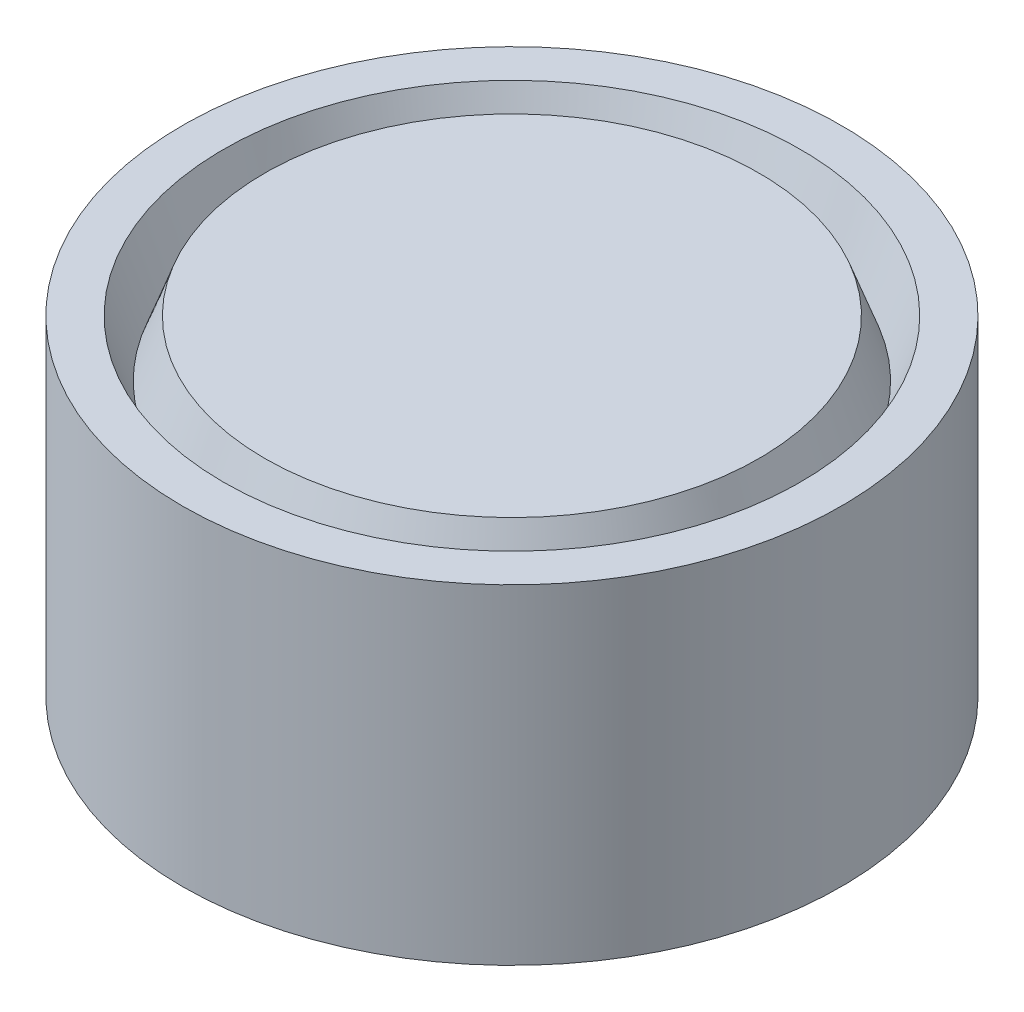
ISO-10303-21;
HEADER;
FILE_DESCRIPTION(('STEP AP214'),'2;1');
FILE_NAME('part.step','',(''),(''),'','','');
FILE_SCHEMA(('AUTOMOTIVE_DESIGN { 1 0 10303 214 1 1 1 1 }'));
ENDSEC;
DATA;
#1=APPLICATION_CONTEXT('core data for automotive mechanical design processes');
#2=APPLICATION_PROTOCOL_DEFINITION('international standard','automotive_design',2000,#1);
#3=PRODUCT_CONTEXT('',#1,'mechanical');
#4=PRODUCT('Part','Part','',(#3));
#5=PRODUCT_RELATED_PRODUCT_CATEGORY('part','',(#4));
#6=PRODUCT_DEFINITION_FORMATION('','',#4);
#7=PRODUCT_DEFINITION_CONTEXT('part definition',#1,'design');
#8=PRODUCT_DEFINITION('design','',#6,#7);
#9=PRODUCT_DEFINITION_SHAPE('','',#8);
#10=(LENGTH_UNIT() NAMED_UNIT(*) SI_UNIT(.MILLI.,.METRE.));
#11=(NAMED_UNIT(*) PLANE_ANGLE_UNIT() SI_UNIT($,.RADIAN.));
#12=(NAMED_UNIT(*) SI_UNIT($,.STERADIAN.) SOLID_ANGLE_UNIT());
#13=UNCERTAINTY_MEASURE_WITH_UNIT(LENGTH_MEASURE(1.E-05),#10,'distance_accuracy_value','');
#14=(GEOMETRIC_REPRESENTATION_CONTEXT(3) GLOBAL_UNCERTAINTY_ASSIGNED_CONTEXT((#13)) GLOBAL_UNIT_ASSIGNED_CONTEXT((#10,
#11,#12)) REPRESENTATION_CONTEXT('',''));
#15=CARTESIAN_POINT('',(0.,0.,0.));
#16=DIRECTION('',(0.,0.,1.));
#17=DIRECTION('',(1.,0.,0.));
#18=AXIS2_PLACEMENT_3D('',#15,#16,#17);
#19=CARTESIAN_POINT('',(0.,20.,0.));
#20=DIRECTION('',(0.,-1.,0.));
#21=DIRECTION('',(0.,0.,-1.));
#22=AXIS2_PLACEMENT_3D('',#19,#20,#21);
#23=CYLINDRICAL_SURFACE('',#22,20.);
#24=CARTESIAN_POINT('',(0.,20.,0.));
#25=DIRECTION('',(0.,1.,0.));
#26=DIRECTION('',(0.,0.,1.));
#27=AXIS2_PLACEMENT_3D('',#24,#25,#26);
#28=CIRCLE('',#27,20.);
#29=CARTESIAN_POINT('',(0.,20.,20.));
#30=VERTEX_POINT('',#29);
#31=EDGE_CURVE('E10',#30,#30,#28,.T.);
#32=ORIENTED_EDGE('',*,*,#31,.F.);
#33=EDGE_LOOP('',(#32));
#34=FACE_BOUND('',#33,.T.);
#35=CARTESIAN_POINT('',(0.,0.,0.));
#36=DIRECTION('',(0.,1.,0.));
#37=DIRECTION('',(0.,0.,1.));
#38=AXIS2_PLACEMENT_3D('',#35,#36,#37);
#39=CIRCLE('',#38,20.);
#40=CARTESIAN_POINT('',(0.,0.,20.));
#41=VERTEX_POINT('',#40);
#42=EDGE_CURVE('E40',#41,#41,#39,.T.);
#43=ORIENTED_EDGE('',*,*,#42,.T.);
#44=EDGE_LOOP('',(#43));
#45=FACE_BOUND('',#44,.T.);
#46=ADVANCED_FACE('F37',(#34,#45),#23,.T.);
#47=CARTESIAN_POINT('',(0.,20.,0.));
#48=DIRECTION('',(0.,1.,0.));
#49=DIRECTION('',(0.,0.,1.));
#50=AXIS2_PLACEMENT_3D('',#47,#48,#49);
#51=PLANE('',#50);
#52=CARTESIAN_POINT('',(0.,20.,0.));
#53=DIRECTION('',(0.,1.,0.));
#54=DIRECTION('',(0.,0.,1.));
#55=AXIS2_PLACEMENT_3D('',#52,#53,#54);
#56=CIRCLE('',#55,17.5);
#57=CARTESIAN_POINT('',(0.,20.,17.5));
#58=VERTEX_POINT('',#57);
#59=EDGE_CURVE('E51',#58,#58,#56,.T.);
#60=ORIENTED_EDGE('',*,*,#59,.F.);
#61=EDGE_LOOP('',(#60));
#62=FACE_BOUND('',#61,.T.);
#63=ORIENTED_EDGE('',*,*,#31,.T.);
#64=EDGE_LOOP('',(#63));
#65=FACE_BOUND('',#64,.T.);
#66=ADVANCED_FACE('F77',(#62,#65),#51,.T.);
#67=CARTESIAN_POINT('',(0.,0.,0.));
#68=DIRECTION('',(0.,1.,0.));
#69=DIRECTION('',(0.,0.,1.));
#70=AXIS2_PLACEMENT_3D('',#67,#68,#69);
#71=PLANE('',#70);
#72=CARTESIAN_POINT('',(0.,0.,0.));
#73=DIRECTION('',(0.,-1.,0.));
#74=DIRECTION('',(0.,0.,-1.));
#75=AXIS2_PLACEMENT_3D('',#72,#73,#74);
#76=CIRCLE('',#75,2.);
#77=CARTESIAN_POINT('',(0.,0.,-2.));
#78=VERTEX_POINT('',#77);
#79=EDGE_CURVE('E58',#78,#78,#76,.T.);
#80=ORIENTED_EDGE('',*,*,#79,.F.);
#81=EDGE_LOOP('',(#80));
#82=FACE_BOUND('',#81,.T.);
#83=ORIENTED_EDGE('',*,*,#42,.F.);
#84=EDGE_LOOP('',(#83));
#85=FACE_BOUND('',#84,.T.);
#86=ADVANCED_FACE('F73',(#82,#85),#71,.F.);
#87=CARTESIAN_POINT('',(0.,20.,0.));
#88=DIRECTION('',(0.,1.,0.));
#89=DIRECTION('',(0.,0.,1.));
#90=AXIS2_PLACEMENT_3D('',#87,#88,#89);
#91=CONICAL_SURFACE('',#90,17.5,0.349065850398867);
#92=ORIENTED_EDGE('',*,*,#59,.T.);
#93=EDGE_LOOP('',(#92));
#94=FACE_BOUND('',#93,.T.);
#95=CARTESIAN_POINT('',(0.,16.5656532256817,0.));
#96=DIRECTION('',(0.,1.,0.));
#97=DIRECTION('',(0.,0.,1.));
#98=AXIS2_PLACEMENT_3D('',#95,#96,#97);
#99=CIRCLE('',#98,16.25);
#100=CARTESIAN_POINT('',(0.,16.5656532256817,16.25));
#101=VERTEX_POINT('',#100);
#102=EDGE_CURVE('E47',#101,#101,#99,.T.);
#103=ORIENTED_EDGE('',*,*,#102,.F.);
#104=EDGE_LOOP('',(#103));
#105=FACE_BOUND('',#104,.T.);
#106=ADVANCED_FACE('F76',(#94,#105),#91,.F.);
#107=CARTESIAN_POINT('',(0.,20.,0.));
#108=DIRECTION('',(0.,-1.,0.));
#109=DIRECTION('',(0.,0.,1.));
#110=AXIS2_PLACEMENT_3D('',#107,#108,#109);
#111=CONICAL_SURFACE('',#110,15.,0.349065850398867);
#112=ORIENTED_EDGE('',*,*,#102,.T.);
#113=EDGE_LOOP('',(#112));
#114=FACE_BOUND('',#113,.T.);
#115=CARTESIAN_POINT('',(0.,20.,0.));
#116=DIRECTION('',(0.,1.,0.));
#117=DIRECTION('',(0.,0.,1.));
#118=AXIS2_PLACEMENT_3D('',#115,#116,#117);
#119=CIRCLE('',#118,15.);
#120=CARTESIAN_POINT('',(0.,20.,15.));
#121=VERTEX_POINT('',#120);
#122=EDGE_CURVE('E54',#121,#121,#119,.T.);
#123=ORIENTED_EDGE('',*,*,#122,.F.);
#124=EDGE_LOOP('',(#123));
#125=FACE_BOUND('',#124,.T.);
#126=ADVANCED_FACE('F92',(#114,#125),#111,.T.);
#127=ORIENTED_EDGE('',*,*,#122,.T.);
#128=EDGE_LOOP('',(#127));
#129=FACE_BOUND('',#128,.T.);
#130=ADVANCED_FACE('F69',(#129),#51,.T.);
#131=CARTESIAN_POINT('',(0.,5.,0.));
#132=DIRECTION('',(0.,-1.,0.));
#133=DIRECTION('',(0.,0.,-1.));
#134=AXIS2_PLACEMENT_3D('',#131,#132,#133);
#135=CYLINDRICAL_SURFACE('',#134,2.);
#136=CARTESIAN_POINT('',(0.,5.,0.));
#137=DIRECTION('',(0.,-1.,0.));
#138=DIRECTION('',(0.,0.,-1.));
#139=AXIS2_PLACEMENT_3D('',#136,#137,#138);
#140=CIRCLE('',#139,2.);
#141=CARTESIAN_POINT('',(0.,5.,-2.));
#142=VERTEX_POINT('',#141);
#143=EDGE_CURVE('E57',#142,#142,#140,.T.);
#144=ORIENTED_EDGE('',*,*,#143,.F.);
#145=EDGE_LOOP('',(#144));
#146=FACE_BOUND('',#145,.T.);
#147=ORIENTED_EDGE('',*,*,#79,.T.);
#148=EDGE_LOOP('',(#147));
#149=FACE_BOUND('',#148,.T.);
#150=ADVANCED_FACE('F66',(#146,#149),#135,.F.);
#151=CARTESIAN_POINT('',(0.,5.,0.));
#152=DIRECTION('',(0.,-1.,0.));
#153=DIRECTION('',(0.,0.,-1.));
#154=AXIS2_PLACEMENT_3D('',#151,#152,#153);
#155=PLANE('',#154);
#156=ORIENTED_EDGE('',*,*,#143,.T.);
#157=EDGE_LOOP('',(#156));
#158=FACE_BOUND('',#157,.T.);
#159=ADVANCED_FACE('F64',(#158),#155,.T.);
#160=CLOSED_SHELL('',(#46,#66,#86,#106,#126,#130,#150,#159));
#161=MANIFOLD_SOLID_BREP('B2',#160);
#162=ADVANCED_BREP_SHAPE_REPRESENTATION('',(#18,#161),#14);
#163=SHAPE_DEFINITION_REPRESENTATION(#9,#162);
ENDSEC;
END-ISO-10303-21;
